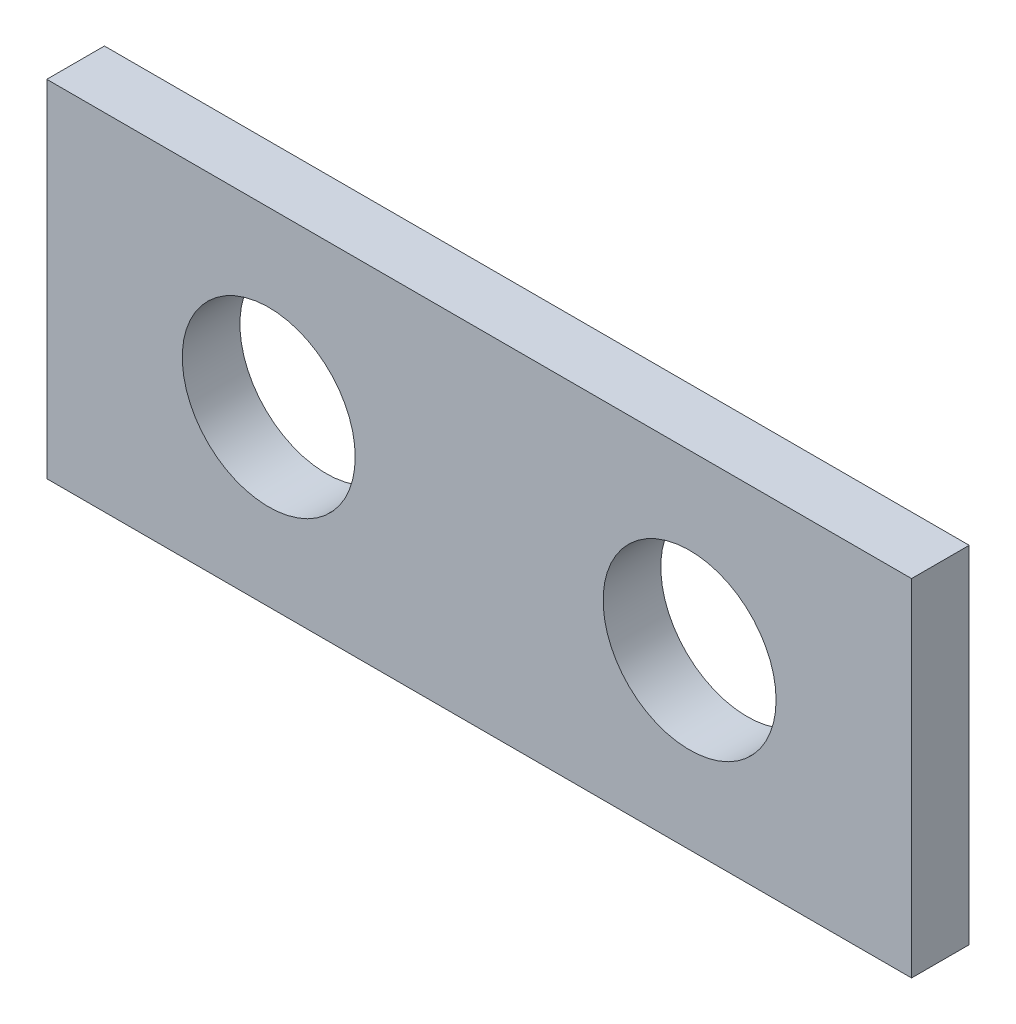
ISO-10303-21;
HEADER;
FILE_DESCRIPTION(('STEP AP214'),'2;1');
FILE_NAME('part.step','',(''),(''),'','','');
FILE_SCHEMA(('AUTOMOTIVE_DESIGN { 1 0 10303 214 1 1 1 1 }'));
ENDSEC;
DATA;
#1=APPLICATION_CONTEXT('core data for automotive mechanical design processes');
#2=APPLICATION_PROTOCOL_DEFINITION('international standard','automotive_design',2000,#1);
#3=PRODUCT_CONTEXT('',#1,'mechanical');
#4=PRODUCT('Part','Part','',(#3));
#5=PRODUCT_RELATED_PRODUCT_CATEGORY('part','',(#4));
#6=PRODUCT_DEFINITION_FORMATION('','',#4);
#7=PRODUCT_DEFINITION_CONTEXT('part definition',#1,'design');
#8=PRODUCT_DEFINITION('design','',#6,#7);
#9=PRODUCT_DEFINITION_SHAPE('','',#8);
#10=(LENGTH_UNIT() NAMED_UNIT(*) SI_UNIT(.MILLI.,.METRE.));
#11=(NAMED_UNIT(*) PLANE_ANGLE_UNIT() SI_UNIT($,.RADIAN.));
#12=(NAMED_UNIT(*) SI_UNIT($,.STERADIAN.) SOLID_ANGLE_UNIT());
#13=UNCERTAINTY_MEASURE_WITH_UNIT(LENGTH_MEASURE(1.E-05),#10,'distance_accuracy_value','');
#14=(GEOMETRIC_REPRESENTATION_CONTEXT(3) GLOBAL_UNCERTAINTY_ASSIGNED_CONTEXT((#13)) GLOBAL_UNIT_ASSIGNED_CONTEXT((#10,
#11,#12)) REPRESENTATION_CONTEXT('',''));
#15=CARTESIAN_POINT('',(0.,0.,0.));
#16=DIRECTION('',(0.,0.,1.));
#17=DIRECTION('',(1.,0.,0.));
#18=AXIS2_PLACEMENT_3D('',#15,#16,#17);
#19=CARTESIAN_POINT('',(0.,0.,1.));
#20=DIRECTION('',(0.,-1.,0.));
#21=DIRECTION('',(1.,0.,0.));
#22=AXIS2_PLACEMENT_3D('',#19,#20,#21);
#23=PLANE('',#22);
#24=DIRECTION('',(-1.,0.,0.));
#25=VECTOR('',#24,1.);
#26=CARTESIAN_POINT('',(0.,0.,0.));
#27=LINE('',#26,#25);
#28=CARTESIAN_POINT('',(0.,0.,0.));
#29=VERTEX_POINT('',#28);
#30=CARTESIAN_POINT('',(-15.,0.,0.));
#31=VERTEX_POINT('',#30);
#32=EDGE_CURVE('E103',#29,#31,#27,.T.);
#33=ORIENTED_EDGE('',*,*,#32,.F.);
#34=DIRECTION('',(0.,0.,-1.));
#35=VECTOR('',#34,1.);
#36=CARTESIAN_POINT('',(0.,0.,1.));
#37=LINE('',#36,#35);
#38=CARTESIAN_POINT('',(0.,0.,1.));
#39=VERTEX_POINT('',#38);
#40=EDGE_CURVE('E11',#39,#29,#37,.T.);
#41=ORIENTED_EDGE('',*,*,#40,.F.);
#42=DIRECTION('',(-1.,0.,0.));
#43=VECTOR('',#42,1.);
#44=CARTESIAN_POINT('',(0.,0.,1.));
#45=LINE('',#44,#43);
#46=CARTESIAN_POINT('',(-15.,0.,1.));
#47=VERTEX_POINT('',#46);
#48=EDGE_CURVE('E89',#39,#47,#45,.T.);
#49=ORIENTED_EDGE('',*,*,#48,.T.);
#50=DIRECTION('',(0.,0.,-1.));
#51=VECTOR('',#50,1.);
#52=CARTESIAN_POINT('',(-15.,0.,1.));
#53=LINE('',#52,#51);
#54=EDGE_CURVE('E50',#47,#31,#53,.T.);
#55=ORIENTED_EDGE('',*,*,#54,.T.);
#56=EDGE_LOOP('',(#33,#41,#49,#55));
#57=FACE_BOUND('',#56,.T.);
#58=ADVANCED_FACE('F33',(#57),#23,.T.);
#59=CARTESIAN_POINT('',(0.,0.,1.));
#60=DIRECTION('',(1.,0.,0.));
#61=DIRECTION('',(0.,0.,-1.));
#62=AXIS2_PLACEMENT_3D('',#59,#60,#61);
#63=PLANE('',#62);
#64=DIRECTION('',(0.,-1.,0.));
#65=VECTOR('',#64,1.);
#66=CARTESIAN_POINT('',(0.,0.,0.));
#67=LINE('',#66,#65);
#68=CARTESIAN_POINT('',(0.,6.,0.));
#69=VERTEX_POINT('',#68);
#70=EDGE_CURVE('E80',#69,#29,#67,.T.);
#71=ORIENTED_EDGE('',*,*,#70,.F.);
#72=DIRECTION('',(0.,0.,-1.));
#73=VECTOR('',#72,1.);
#74=CARTESIAN_POINT('',(0.,6.,1.));
#75=LINE('',#74,#73);
#76=CARTESIAN_POINT('',(0.,6.,1.));
#77=VERTEX_POINT('',#76);
#78=EDGE_CURVE('E42',#77,#69,#75,.T.);
#79=ORIENTED_EDGE('',*,*,#78,.F.);
#80=DIRECTION('',(0.,-1.,0.));
#81=VECTOR('',#80,1.);
#82=CARTESIAN_POINT('',(0.,0.,1.));
#83=LINE('',#82,#81);
#84=EDGE_CURVE('E78',#77,#39,#83,.T.);
#85=ORIENTED_EDGE('',*,*,#84,.T.);
#86=ORIENTED_EDGE('',*,*,#40,.T.);
#87=EDGE_LOOP('',(#71,#79,#85,#86));
#88=FACE_BOUND('',#87,.T.);
#89=ADVANCED_FACE('F77',(#88),#63,.T.);
#90=CARTESIAN_POINT('',(0.,6.,1.));
#91=DIRECTION('',(0.,1.,0.));
#92=DIRECTION('',(0.,0.,1.));
#93=AXIS2_PLACEMENT_3D('',#90,#91,#92);
#94=PLANE('',#93);
#95=DIRECTION('',(1.,0.,0.));
#96=VECTOR('',#95,1.);
#97=CARTESIAN_POINT('',(0.,6.,0.));
#98=LINE('',#97,#96);
#99=CARTESIAN_POINT('',(-15.,6.,0.));
#100=VERTEX_POINT('',#99);
#101=EDGE_CURVE('E106',#100,#69,#98,.T.);
#102=ORIENTED_EDGE('',*,*,#101,.F.);
#103=DIRECTION('',(0.,0.,-1.));
#104=VECTOR('',#103,1.);
#105=CARTESIAN_POINT('',(-15.,6.,1.));
#106=LINE('',#105,#104);
#107=CARTESIAN_POINT('',(-15.,6.,1.));
#108=VERTEX_POINT('',#107);
#109=EDGE_CURVE('E63',#108,#100,#106,.T.);
#110=ORIENTED_EDGE('',*,*,#109,.F.);
#111=DIRECTION('',(1.,0.,0.));
#112=VECTOR('',#111,1.);
#113=CARTESIAN_POINT('',(0.,6.,1.));
#114=LINE('',#113,#112);
#115=EDGE_CURVE('E88',#108,#77,#114,.T.);
#116=ORIENTED_EDGE('',*,*,#115,.T.);
#117=ORIENTED_EDGE('',*,*,#78,.T.);
#118=EDGE_LOOP('',(#102,#110,#116,#117));
#119=FACE_BOUND('',#118,.T.);
#120=ADVANCED_FACE('F91',(#119),#94,.T.);
#121=CARTESIAN_POINT('',(-11.15,3.,1.));
#122=DIRECTION('',(0.,0.,-1.));
#123=DIRECTION('',(-1.,0.,0.));
#124=AXIS2_PLACEMENT_3D('',#121,#122,#123);
#125=CYLINDRICAL_SURFACE('',#124,1.5);
#126=CARTESIAN_POINT('',(-11.15,3.,1.));
#127=DIRECTION('',(0.,0.,1.));
#128=DIRECTION('',(1.,0.,0.));
#129=AXIS2_PLACEMENT_3D('',#126,#127,#128);
#130=CIRCLE('',#129,1.5);
#131=CARTESIAN_POINT('',(-9.65000000000001,3.,1.));
#132=VERTEX_POINT('',#131);
#133=EDGE_CURVE('E115',#132,#132,#130,.T.);
#134=ORIENTED_EDGE('',*,*,#133,.T.);
#135=EDGE_LOOP('',(#134));
#136=FACE_BOUND('',#135,.T.);
#137=CARTESIAN_POINT('',(-11.15,3.,0.));
#138=DIRECTION('',(0.,0.,1.));
#139=DIRECTION('',(1.,0.,0.));
#140=AXIS2_PLACEMENT_3D('',#137,#138,#139);
#141=CIRCLE('',#140,1.5);
#142=CARTESIAN_POINT('',(-9.65000000000001,3.,0.));
#143=VERTEX_POINT('',#142);
#144=EDGE_CURVE('E100',#143,#143,#141,.T.);
#145=ORIENTED_EDGE('',*,*,#144,.F.);
#146=EDGE_LOOP('',(#145));
#147=FACE_BOUND('',#146,.T.);
#148=ADVANCED_FACE('F131',(#136,#147),#125,.F.);
#149=CARTESIAN_POINT('',(-3.85,3.,1.));
#150=DIRECTION('',(0.,0.,-1.));
#151=DIRECTION('',(-1.,0.,0.));
#152=AXIS2_PLACEMENT_3D('',#149,#150,#151);
#153=CYLINDRICAL_SURFACE('',#152,1.5);
#154=CARTESIAN_POINT('',(-3.85,3.,1.));
#155=DIRECTION('',(0.,0.,1.));
#156=DIRECTION('',(1.,0.,0.));
#157=AXIS2_PLACEMENT_3D('',#154,#155,#156);
#158=CIRCLE('',#157,1.5);
#159=CARTESIAN_POINT('',(-2.35,3.,1.));
#160=VERTEX_POINT('',#159);
#161=EDGE_CURVE('E111',#160,#160,#158,.T.);
#162=ORIENTED_EDGE('',*,*,#161,.T.);
#163=EDGE_LOOP('',(#162));
#164=FACE_BOUND('',#163,.T.);
#165=CARTESIAN_POINT('',(-3.85,3.,0.));
#166=DIRECTION('',(0.,0.,1.));
#167=DIRECTION('',(1.,0.,0.));
#168=AXIS2_PLACEMENT_3D('',#165,#166,#167);
#169=CIRCLE('',#168,1.5);
#170=CARTESIAN_POINT('',(-2.35,3.,0.));
#171=VERTEX_POINT('',#170);
#172=EDGE_CURVE('E97',#171,#171,#169,.T.);
#173=ORIENTED_EDGE('',*,*,#172,.F.);
#174=EDGE_LOOP('',(#173));
#175=FACE_BOUND('',#174,.T.);
#176=ADVANCED_FACE('F35',(#164,#175),#153,.F.);
#177=CARTESIAN_POINT('',(-15.,0.,1.));
#178=DIRECTION('',(-1.,0.,0.));
#179=DIRECTION('',(0.,0.,1.));
#180=AXIS2_PLACEMENT_3D('',#177,#178,#179);
#181=PLANE('',#180);
#182=DIRECTION('',(0.,1.,0.));
#183=VECTOR('',#182,1.);
#184=CARTESIAN_POINT('',(-15.,0.,0.));
#185=LINE('',#184,#183);
#186=EDGE_CURVE('E108',#31,#100,#185,.T.);
#187=ORIENTED_EDGE('',*,*,#186,.F.);
#188=ORIENTED_EDGE('',*,*,#54,.F.);
#189=DIRECTION('',(0.,1.,0.));
#190=VECTOR('',#189,1.);
#191=CARTESIAN_POINT('',(-15.,0.,1.));
#192=LINE('',#191,#190);
#193=EDGE_CURVE('E92',#47,#108,#192,.T.);
#194=ORIENTED_EDGE('',*,*,#193,.T.);
#195=ORIENTED_EDGE('',*,*,#109,.T.);
#196=EDGE_LOOP('',(#187,#188,#194,#195));
#197=FACE_BOUND('',#196,.T.);
#198=ADVANCED_FACE('F121',(#197),#181,.T.);
#199=CARTESIAN_POINT('',(0.,0.,1.));
#200=DIRECTION('',(0.,0.,1.));
#201=DIRECTION('',(1.,0.,0.));
#202=AXIS2_PLACEMENT_3D('',#199,#200,#201);
#203=PLANE('',#202);
#204=ORIENTED_EDGE('',*,*,#161,.F.);
#205=EDGE_LOOP('',(#204));
#206=FACE_BOUND('',#205,.T.);
#207=ORIENTED_EDGE('',*,*,#133,.F.);
#208=EDGE_LOOP('',(#207));
#209=FACE_BOUND('',#208,.T.);
#210=ORIENTED_EDGE('',*,*,#48,.F.);
#211=ORIENTED_EDGE('',*,*,#84,.F.);
#212=ORIENTED_EDGE('',*,*,#115,.F.);
#213=ORIENTED_EDGE('',*,*,#193,.F.);
#214=EDGE_LOOP('',(#210,#211,#212,#213));
#215=FACE_BOUND('',#214,.T.);
#216=ADVANCED_FACE('F86',(#206,#209,#215),#203,.T.);
#217=CARTESIAN_POINT('',(0.,0.,0.));
#218=DIRECTION('',(0.,0.,1.));
#219=DIRECTION('',(1.,0.,0.));
#220=AXIS2_PLACEMENT_3D('',#217,#218,#219);
#221=PLANE('',#220);
#222=ORIENTED_EDGE('',*,*,#172,.T.);
#223=EDGE_LOOP('',(#222));
#224=FACE_BOUND('',#223,.T.);
#225=ORIENTED_EDGE('',*,*,#144,.T.);
#226=EDGE_LOOP('',(#225));
#227=FACE_BOUND('',#226,.T.);
#228=ORIENTED_EDGE('',*,*,#32,.T.);
#229=ORIENTED_EDGE('',*,*,#186,.T.);
#230=ORIENTED_EDGE('',*,*,#101,.T.);
#231=ORIENTED_EDGE('',*,*,#70,.T.);
#232=EDGE_LOOP('',(#228,#229,#230,#231));
#233=FACE_BOUND('',#232,.T.);
#234=ADVANCED_FACE('F128',(#224,#227,#233),#221,.F.);
#235=CLOSED_SHELL('',(#58,#89,#120,#148,#176,#198,#216,#234));
#236=MANIFOLD_SOLID_BREP('B2',#235);
#237=ADVANCED_BREP_SHAPE_REPRESENTATION('',(#18,#236),#14);
#238=SHAPE_DEFINITION_REPRESENTATION(#9,#237);
ENDSEC;
END-ISO-10303-21;
